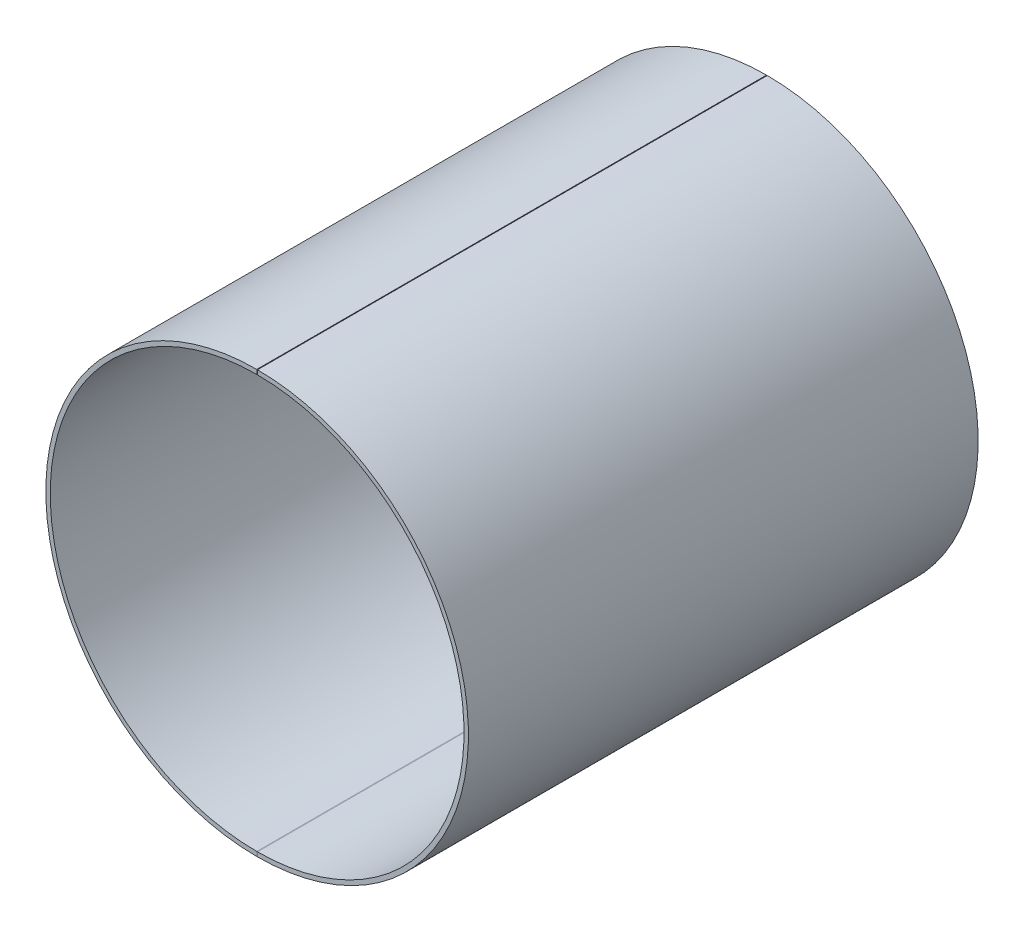
ISO-10303-21;
HEADER;
FILE_DESCRIPTION(('STEP AP214'),'2;1');
FILE_NAME('part.step','',(''),(''),'','','');
FILE_SCHEMA(('AUTOMOTIVE_DESIGN { 1 0 10303 214 1 1 1 1 }'));
ENDSEC;
DATA;
#1=APPLICATION_CONTEXT('core data for automotive mechanical design processes');
#2=APPLICATION_PROTOCOL_DEFINITION('international standard','automotive_design',2000,#1);
#3=PRODUCT_CONTEXT('',#1,'mechanical');
#4=PRODUCT('Part','Part','',(#3));
#5=PRODUCT_RELATED_PRODUCT_CATEGORY('part','',(#4));
#6=PRODUCT_DEFINITION_FORMATION('','',#4);
#7=PRODUCT_DEFINITION_CONTEXT('part definition',#1,'design');
#8=PRODUCT_DEFINITION('design','',#6,#7);
#9=PRODUCT_DEFINITION_SHAPE('','',#8);
#10=(LENGTH_UNIT() NAMED_UNIT(*) SI_UNIT(.MILLI.,.METRE.));
#11=(NAMED_UNIT(*) PLANE_ANGLE_UNIT() SI_UNIT($,.RADIAN.));
#12=(NAMED_UNIT(*) SI_UNIT($,.STERADIAN.) SOLID_ANGLE_UNIT());
#13=UNCERTAINTY_MEASURE_WITH_UNIT(LENGTH_MEASURE(1.E-05),#10,'distance_accuracy_value','');
#14=(GEOMETRIC_REPRESENTATION_CONTEXT(3) GLOBAL_UNCERTAINTY_ASSIGNED_CONTEXT((#13)) GLOBAL_UNIT_ASSIGNED_CONTEXT((#10,
#11,#12)) REPRESENTATION_CONTEXT('',''));
#15=CARTESIAN_POINT('',(0.,0.,0.));
#16=DIRECTION('',(0.,0.,1.));
#17=DIRECTION('',(1.,0.,0.));
#18=AXIS2_PLACEMENT_3D('',#15,#16,#17);
#19=CARTESIAN_POINT('',(0.254,-152.4,368.3));
#20=DIRECTION('',(0.,0.,1.));
#21=DIRECTION('',(1.,0.,0.));
#22=AXIS2_PLACEMENT_3D('',#19,#20,#21);
#23=PLANE('',#22);
#24=DIRECTION('',(0.,1.,0.));
#25=VECTOR('',#24,1.);
#26=CARTESIAN_POINT('',(0.254,-152.4,368.3));
#27=LINE('',#26,#25);
#28=CARTESIAN_POINT('',(0.254,-152.4,368.3));
#29=VERTEX_POINT('',#28);
#30=CARTESIAN_POINT('',(0.254,-149.225,368.3));
#31=VERTEX_POINT('',#30);
#32=EDGE_CURVE('E11',#29,#31,#27,.T.);
#33=ORIENTED_EDGE('',*,*,#32,.F.);
#34=CARTESIAN_POINT('',(0.254000000000028,0.,368.3));
#35=DIRECTION('',(0.,0.,-1.));
#36=DIRECTION('',(1.,0.,0.));
#37=AXIS2_PLACEMENT_3D('',#34,#35,#36);
#38=CIRCLE('',#37,152.4);
#39=CARTESIAN_POINT('',(0.254000000000038,152.4,368.3));
#40=VERTEX_POINT('',#39);
#41=EDGE_CURVE('E131',#40,#29,#38,.T.);
#42=ORIENTED_EDGE('',*,*,#41,.F.);
#43=DIRECTION('',(0.,1.,0.));
#44=VECTOR('',#43,1.);
#45=CARTESIAN_POINT('',(0.254000000000037,149.225,368.3));
#46=LINE('',#45,#44);
#47=CARTESIAN_POINT('',(0.254000000000037,149.225,368.3));
#48=VERTEX_POINT('',#47);
#49=EDGE_CURVE('E113',#48,#40,#46,.T.);
#50=ORIENTED_EDGE('',*,*,#49,.F.);
#51=CARTESIAN_POINT('',(0.254000000000028,0.,368.3));
#52=DIRECTION('',(0.,0.,1.));
#53=DIRECTION('',(1.,0.,0.));
#54=AXIS2_PLACEMENT_3D('',#51,#52,#53);
#55=CIRCLE('',#54,149.225);
#56=EDGE_CURVE('E122',#48,#31,#55,.F.);
#57=ORIENTED_EDGE('',*,*,#56,.T.);
#58=EDGE_LOOP('',(#33,#42,#50,#57));
#59=FACE_BOUND('',#58,.T.);
#60=ADVANCED_FACE('F37',(#59),#23,.T.);
#61=CARTESIAN_POINT('',(0.254,-149.225,0.));
#62=DIRECTION('',(0.,0.,-1.));
#63=DIRECTION('',(-1.,0.,0.));
#64=AXIS2_PLACEMENT_3D('',#61,#62,#63);
#65=PLANE('',#64);
#66=DIRECTION('',(0.,-1.,0.));
#67=VECTOR('',#66,1.);
#68=CARTESIAN_POINT('',(0.254,-149.225,0.));
#69=LINE('',#68,#67);
#70=CARTESIAN_POINT('',(0.254,-149.225,0.));
#71=VERTEX_POINT('',#70);
#72=CARTESIAN_POINT('',(0.254,-152.4,0.));
#73=VERTEX_POINT('',#72);
#74=EDGE_CURVE('E45',#71,#73,#69,.T.);
#75=ORIENTED_EDGE('',*,*,#74,.F.);
#76=CARTESIAN_POINT('',(0.254000000000028,0.,0.));
#77=DIRECTION('',(0.,0.,1.));
#78=DIRECTION('',(1.,0.,0.));
#79=AXIS2_PLACEMENT_3D('',#76,#77,#78);
#80=CIRCLE('',#79,149.225);
#81=CARTESIAN_POINT('',(0.254000000000037,149.225,0.));
#82=VERTEX_POINT('',#81);
#83=EDGE_CURVE('E153',#82,#71,#80,.F.);
#84=ORIENTED_EDGE('',*,*,#83,.F.);
#85=DIRECTION('',(0.,1.,0.));
#86=VECTOR('',#85,1.);
#87=CARTESIAN_POINT('',(0.254000000000037,149.225,0.));
#88=LINE('',#87,#86);
#89=CARTESIAN_POINT('',(0.254000000000038,152.4,0.));
#90=VERTEX_POINT('',#89);
#91=EDGE_CURVE('E115',#82,#90,#88,.T.);
#92=ORIENTED_EDGE('',*,*,#91,.T.);
#93=CARTESIAN_POINT('',(0.254000000000028,0.,0.));
#94=DIRECTION('',(0.,0.,-1.));
#95=DIRECTION('',(1.,0.,0.));
#96=AXIS2_PLACEMENT_3D('',#93,#94,#95);
#97=CIRCLE('',#96,152.4);
#98=EDGE_CURVE('E150',#90,#73,#97,.T.);
#99=ORIENTED_EDGE('',*,*,#98,.T.);
#100=EDGE_LOOP('',(#75,#84,#92,#99));
#101=FACE_BOUND('',#100,.T.);
#102=ADVANCED_FACE('F184',(#101),#65,.T.);
#103=CARTESIAN_POINT('',(-0.254000000000056,-149.225,368.3));
#104=DIRECTION('',(0.,0.,1.));
#105=DIRECTION('',(1.,0.,0.));
#106=AXIS2_PLACEMENT_3D('',#103,#104,#105);
#107=PLANE('',#106);
#108=DIRECTION('',(0.,-1.,0.));
#109=VECTOR('',#108,1.);
#110=CARTESIAN_POINT('',(-0.254000000000056,-149.225,368.3));
#111=LINE('',#110,#109);
#112=CARTESIAN_POINT('',(-0.254000000000056,-149.225,368.3));
#113=VERTEX_POINT('',#112);
#114=CARTESIAN_POINT('',(-0.253999999999972,-152.4,368.3));
#115=VERTEX_POINT('',#114);
#116=EDGE_CURVE('E53',#113,#115,#111,.T.);
#117=ORIENTED_EDGE('',*,*,#116,.F.);
#118=CARTESIAN_POINT('',(-0.254000000000028,0.,368.3));
#119=DIRECTION('',(0.,0.,1.));
#120=DIRECTION('',(1.,0.,0.));
#121=AXIS2_PLACEMENT_3D('',#118,#119,#120);
#122=CIRCLE('',#121,149.225);
#123=CARTESIAN_POINT('',(-0.254000000000052,149.225,368.3));
#124=VERTEX_POINT('',#123);
#125=EDGE_CURVE('E93',#113,#124,#122,.F.);
#126=ORIENTED_EDGE('',*,*,#125,.T.);
#127=DIRECTION('',(0.,-1.,0.));
#128=VECTOR('',#127,1.);
#129=CARTESIAN_POINT('',(-0.254000000000038,152.4,368.3));
#130=LINE('',#129,#128);
#131=CARTESIAN_POINT('',(-0.254000000000038,152.4,368.3));
#132=VERTEX_POINT('',#131);
#133=EDGE_CURVE('E192',#132,#124,#130,.T.);
#134=ORIENTED_EDGE('',*,*,#133,.F.);
#135=CARTESIAN_POINT('',(-0.254000000000028,0.,368.3));
#136=DIRECTION('',(0.,0.,-1.));
#137=DIRECTION('',(-1.,0.,0.));
#138=AXIS2_PLACEMENT_3D('',#135,#136,#137);
#139=CIRCLE('',#138,152.4);
#140=EDGE_CURVE('E190',#115,#132,#139,.T.);
#141=ORIENTED_EDGE('',*,*,#140,.F.);
#142=EDGE_LOOP('',(#117,#126,#134,#141));
#143=FACE_BOUND('',#142,.T.);
#144=ADVANCED_FACE('F200',(#143),#107,.T.);
#145=CARTESIAN_POINT('',(-0.253999999999972,-152.4,0.));
#146=DIRECTION('',(0.,0.,-1.));
#147=DIRECTION('',(-1.,0.,0.));
#148=AXIS2_PLACEMENT_3D('',#145,#146,#147);
#149=PLANE('',#148);
#150=DIRECTION('',(0.,1.,0.));
#151=VECTOR('',#150,1.);
#152=CARTESIAN_POINT('',(-0.253999999999972,-152.4,0.));
#153=LINE('',#152,#151);
#154=CARTESIAN_POINT('',(-0.253999999999972,-152.4,0.));
#155=VERTEX_POINT('',#154);
#156=CARTESIAN_POINT('',(-0.254000000000056,-149.225,0.));
#157=VERTEX_POINT('',#156);
#158=EDGE_CURVE('E87',#155,#157,#153,.T.);
#159=ORIENTED_EDGE('',*,*,#158,.F.);
#160=CARTESIAN_POINT('',(-0.254000000000028,0.,0.));
#161=DIRECTION('',(0.,0.,-1.));
#162=DIRECTION('',(-1.,0.,0.));
#163=AXIS2_PLACEMENT_3D('',#160,#161,#162);
#164=CIRCLE('',#163,152.4);
#165=CARTESIAN_POINT('',(-0.254000000000038,152.4,0.));
#166=VERTEX_POINT('',#165);
#167=EDGE_CURVE('E145',#155,#166,#164,.T.);
#168=ORIENTED_EDGE('',*,*,#167,.T.);
#169=DIRECTION('',(0.,-1.,0.));
#170=VECTOR('',#169,1.);
#171=CARTESIAN_POINT('',(-0.254000000000038,152.4,0.));
#172=LINE('',#171,#170);
#173=CARTESIAN_POINT('',(-0.254000000000052,149.225,0.));
#174=VERTEX_POINT('',#173);
#175=EDGE_CURVE('E142',#166,#174,#172,.T.);
#176=ORIENTED_EDGE('',*,*,#175,.T.);
#177=CARTESIAN_POINT('',(-0.254000000000028,0.,0.));
#178=DIRECTION('',(0.,0.,1.));
#179=DIRECTION('',(1.,0.,0.));
#180=AXIS2_PLACEMENT_3D('',#177,#178,#179);
#181=CIRCLE('',#180,149.225);
#182=EDGE_CURVE('E139',#157,#174,#181,.F.);
#183=ORIENTED_EDGE('',*,*,#182,.F.);
#184=EDGE_LOOP('',(#159,#168,#176,#183));
#185=FACE_BOUND('',#184,.T.);
#186=ADVANCED_FACE('F204',(#185),#149,.T.);
#187=CARTESIAN_POINT('',(-0.254000000000028,0.,368.3));
#188=DIRECTION('',(0.,0.,-1.));
#189=DIRECTION('',(-1.,0.,0.));
#190=AXIS2_PLACEMENT_3D('',#187,#188,#189);
#191=CYLINDRICAL_SURFACE('',#190,149.225);
#192=ORIENTED_EDGE('',*,*,#182,.T.);
#193=DIRECTION('',(0.,0.,-1.));
#194=VECTOR('',#193,1.);
#195=CARTESIAN_POINT('',(-0.254000000000052,149.225,368.3));
#196=LINE('',#195,#194);
#197=EDGE_CURVE('E169',#124,#174,#196,.T.);
#198=ORIENTED_EDGE('',*,*,#197,.F.);
#199=ORIENTED_EDGE('',*,*,#125,.F.);
#200=DIRECTION('',(0.,0.,-1.));
#201=VECTOR('',#200,1.);
#202=CARTESIAN_POINT('',(-0.254000000000056,-149.225,368.3));
#203=LINE('',#202,#201);
#204=EDGE_CURVE('E138',#113,#157,#203,.T.);
#205=ORIENTED_EDGE('',*,*,#204,.T.);
#206=EDGE_LOOP('',(#192,#198,#199,#205));
#207=FACE_BOUND('',#206,.T.);
#208=ADVANCED_FACE('F207',(#207),#191,.F.);
#209=CARTESIAN_POINT('',(-0.254000000000038,152.4,368.3));
#210=DIRECTION('',(1.,0.,0.));
#211=DIRECTION('',(0.,1.,0.));
#212=AXIS2_PLACEMENT_3D('',#209,#210,#211);
#213=PLANE('',#212);
#214=ORIENTED_EDGE('',*,*,#175,.F.);
#215=DIRECTION('',(0.,0.,-1.));
#216=VECTOR('',#215,1.);
#217=CARTESIAN_POINT('',(-0.254000000000038,152.4,368.3));
#218=LINE('',#217,#216);
#219=EDGE_CURVE('E167',#132,#166,#218,.T.);
#220=ORIENTED_EDGE('',*,*,#219,.F.);
#221=ORIENTED_EDGE('',*,*,#133,.T.);
#222=ORIENTED_EDGE('',*,*,#197,.T.);
#223=EDGE_LOOP('',(#214,#220,#221,#222));
#224=FACE_BOUND('',#223,.T.);
#225=ADVANCED_FACE('F199',(#224),#213,.T.);
#226=CARTESIAN_POINT('',(-0.254000000000028,0.,368.3));
#227=DIRECTION('',(0.,0.,-1.));
#228=DIRECTION('',(-1.,0.,0.));
#229=AXIS2_PLACEMENT_3D('',#226,#227,#228);
#230=CYLINDRICAL_SURFACE('',#229,152.4);
#231=ORIENTED_EDGE('',*,*,#167,.F.);
#232=DIRECTION('',(0.,0.,-1.));
#233=VECTOR('',#232,1.);
#234=CARTESIAN_POINT('',(-0.253999999999972,-152.4,368.3));
#235=LINE('',#234,#233);
#236=EDGE_CURVE('E164',#115,#155,#235,.T.);
#237=ORIENTED_EDGE('',*,*,#236,.F.);
#238=ORIENTED_EDGE('',*,*,#140,.T.);
#239=ORIENTED_EDGE('',*,*,#219,.T.);
#240=EDGE_LOOP('',(#231,#237,#238,#239));
#241=FACE_BOUND('',#240,.T.);
#242=ADVANCED_FACE('F202',(#241),#230,.T.);
#243=CARTESIAN_POINT('',(-0.253999999999972,-152.4,368.3));
#244=DIRECTION('',(0.,-1.,0.));
#245=DIRECTION('',(0.,0.,-1.));
#246=AXIS2_PLACEMENT_3D('',#243,#244,#245);
#247=PLANE('',#246);
#248=DIRECTION('',(-1.,0.,0.));
#249=VECTOR('',#248,1.);
#250=CARTESIAN_POINT('',(-0.253999999999972,-152.4,0.));
#251=LINE('',#250,#249);
#252=EDGE_CURVE('E148',#73,#155,#251,.T.);
#253=ORIENTED_EDGE('',*,*,#252,.F.);
#254=DIRECTION('',(0.,0.,-1.));
#255=VECTOR('',#254,1.);
#256=CARTESIAN_POINT('',(0.254,-152.4,368.3));
#257=LINE('',#256,#255);
#258=EDGE_CURVE('E161',#29,#73,#257,.T.);
#259=ORIENTED_EDGE('',*,*,#258,.F.);
#260=DIRECTION('',(-1.,0.,0.));
#261=VECTOR('',#260,1.);
#262=CARTESIAN_POINT('',(-0.253999999999972,-152.4,368.3));
#263=LINE('',#262,#261);
#264=EDGE_CURVE('E133',#29,#115,#263,.T.);
#265=ORIENTED_EDGE('',*,*,#264,.T.);
#266=ORIENTED_EDGE('',*,*,#236,.T.);
#267=EDGE_LOOP('',(#253,#259,#265,#266));
#268=FACE_BOUND('',#267,.T.);
#269=ADVANCED_FACE('F181',(#268),#247,.T.);
#270=CARTESIAN_POINT('',(0.254000000000028,0.,368.3));
#271=DIRECTION('',(0.,0.,-1.));
#272=DIRECTION('',(-1.,0.,0.));
#273=AXIS2_PLACEMENT_3D('',#270,#271,#272);
#274=CYLINDRICAL_SURFACE('',#273,152.4);
#275=ORIENTED_EDGE('',*,*,#98,.F.);
#276=DIRECTION('',(0.,0.,-1.));
#277=VECTOR('',#276,1.);
#278=CARTESIAN_POINT('',(0.254000000000038,152.4,368.3));
#279=LINE('',#278,#277);
#280=EDGE_CURVE('E117',#40,#90,#279,.T.);
#281=ORIENTED_EDGE('',*,*,#280,.F.);
#282=ORIENTED_EDGE('',*,*,#41,.T.);
#283=ORIENTED_EDGE('',*,*,#258,.T.);
#284=EDGE_LOOP('',(#275,#281,#282,#283));
#285=FACE_BOUND('',#284,.T.);
#286=ADVANCED_FACE('F177',(#285),#274,.T.);
#287=CARTESIAN_POINT('',(0.254000000000037,149.225,368.3));
#288=DIRECTION('',(-1.,0.,0.));
#289=DIRECTION('',(0.,-1.,0.));
#290=AXIS2_PLACEMENT_3D('',#287,#288,#289);
#291=PLANE('',#290);
#292=ORIENTED_EDGE('',*,*,#91,.F.);
#293=DIRECTION('',(0.,0.,-1.));
#294=VECTOR('',#293,1.);
#295=CARTESIAN_POINT('',(0.254000000000037,149.225,368.3));
#296=LINE('',#295,#294);
#297=EDGE_CURVE('E109',#48,#82,#296,.T.);
#298=ORIENTED_EDGE('',*,*,#297,.F.);
#299=ORIENTED_EDGE('',*,*,#49,.T.);
#300=ORIENTED_EDGE('',*,*,#280,.T.);
#301=EDGE_LOOP('',(#292,#298,#299,#300));
#302=FACE_BOUND('',#301,.T.);
#303=ADVANCED_FACE('F111',(#302),#291,.T.);
#304=CARTESIAN_POINT('',(0.254000000000028,0.,368.3));
#305=DIRECTION('',(0.,0.,-1.));
#306=DIRECTION('',(-1.,0.,0.));
#307=AXIS2_PLACEMENT_3D('',#304,#305,#306);
#308=CYLINDRICAL_SURFACE('',#307,149.225);
#309=ORIENTED_EDGE('',*,*,#83,.T.);
#310=DIRECTION('',(0.,0.,-1.));
#311=VECTOR('',#310,1.);
#312=CARTESIAN_POINT('',(0.254,-149.225,368.3));
#313=LINE('',#312,#311);
#314=EDGE_CURVE('E118',#31,#71,#313,.T.);
#315=ORIENTED_EDGE('',*,*,#314,.F.);
#316=ORIENTED_EDGE('',*,*,#56,.F.);
#317=ORIENTED_EDGE('',*,*,#297,.T.);
#318=EDGE_LOOP('',(#309,#315,#316,#317));
#319=FACE_BOUND('',#318,.T.);
#320=ADVANCED_FACE('F123',(#319),#308,.F.);
#321=CARTESIAN_POINT('',(-0.253999999999972,-149.225,368.3));
#322=DIRECTION('',(0.,-1.,0.));
#323=DIRECTION('',(0.,0.,-1.));
#324=AXIS2_PLACEMENT_3D('',#321,#322,#323);
#325=PLANE('',#324);
#326=DIRECTION('',(1.,0.,0.));
#327=VECTOR('',#326,1.);
#328=CARTESIAN_POINT('',(-0.253999999999972,-149.225,0.));
#329=LINE('',#328,#327);
#330=EDGE_CURVE('E155',#71,#157,#329,.F.);
#331=ORIENTED_EDGE('',*,*,#330,.T.);
#332=ORIENTED_EDGE('',*,*,#204,.F.);
#333=DIRECTION('',(1.,0.,0.));
#334=VECTOR('',#333,1.);
#335=CARTESIAN_POINT('',(-0.253999999999972,-149.225,368.3));
#336=LINE('',#335,#334);
#337=EDGE_CURVE('E127',#31,#113,#336,.F.);
#338=ORIENTED_EDGE('',*,*,#337,.F.);
#339=ORIENTED_EDGE('',*,*,#314,.T.);
#340=EDGE_LOOP('',(#331,#332,#338,#339));
#341=FACE_BOUND('',#340,.T.);
#342=ADVANCED_FACE('F186',(#341),#325,.F.);
#343=CARTESIAN_POINT('',(-0.254000000000028,0.,368.3));
#344=DIRECTION('',(0.,0.,1.));
#345=DIRECTION('',(1.,0.,0.));
#346=AXIS2_PLACEMENT_3D('',#343,#344,#345);
#347=PLANE('',#346);
#348=ORIENTED_EDGE('',*,*,#337,.T.);
#349=ORIENTED_EDGE('',*,*,#116,.T.);
#350=ORIENTED_EDGE('',*,*,#264,.F.);
#351=ORIENTED_EDGE('',*,*,#32,.T.);
#352=EDGE_LOOP('',(#348,#349,#350,#351));
#353=FACE_BOUND('',#352,.T.);
#354=ADVANCED_FACE('F189',(#353),#347,.T.);
#355=CARTESIAN_POINT('',(-0.254000000000028,0.,0.));
#356=DIRECTION('',(0.,0.,1.));
#357=DIRECTION('',(1.,0.,0.));
#358=AXIS2_PLACEMENT_3D('',#355,#356,#357);
#359=PLANE('',#358);
#360=ORIENTED_EDGE('',*,*,#252,.T.);
#361=ORIENTED_EDGE('',*,*,#158,.T.);
#362=ORIENTED_EDGE('',*,*,#330,.F.);
#363=ORIENTED_EDGE('',*,*,#74,.T.);
#364=EDGE_LOOP('',(#360,#361,#362,#363));
#365=FACE_BOUND('',#364,.T.);
#366=ADVANCED_FACE('F172',(#365),#359,.F.);
#367=CLOSED_SHELL('',(#60,#102,#144,#186,#208,#225,#242,#269,#286,#303,#320,#342,#354,#366));
#368=MANIFOLD_SOLID_BREP('B2',#367);
#369=ADVANCED_BREP_SHAPE_REPRESENTATION('',(#18,#368),#14);
#370=SHAPE_DEFINITION_REPRESENTATION(#9,#369);
ENDSEC;
END-ISO-10303-21;
